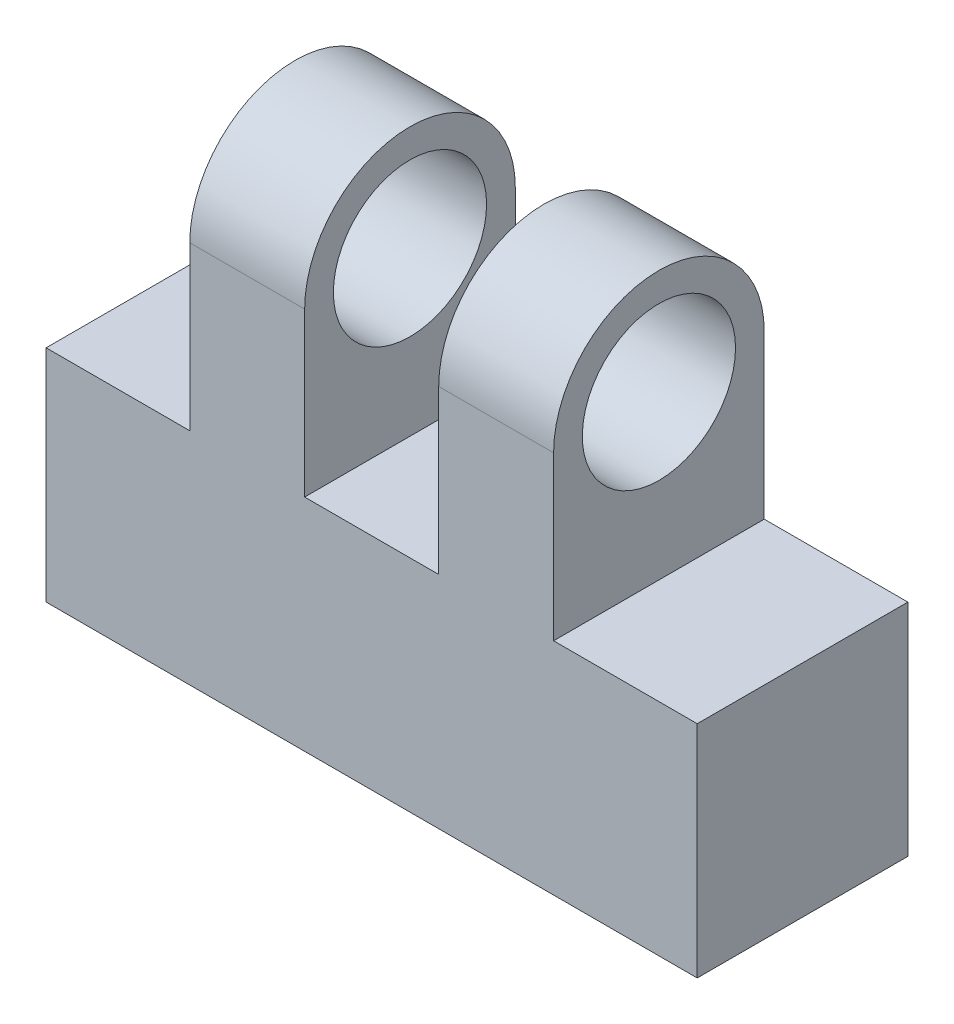
ISO-10303-21;
HEADER;
FILE_DESCRIPTION(('STEP AP214'),'2;1');
FILE_NAME('part.step','',(''),(''),'','','');
FILE_SCHEMA(('AUTOMOTIVE_DESIGN { 1 0 10303 214 1 1 1 1 }'));
ENDSEC;
DATA;
#1=APPLICATION_CONTEXT('core data for automotive mechanical design processes');
#2=APPLICATION_PROTOCOL_DEFINITION('international standard','automotive_design',2000,#1);
#3=PRODUCT_CONTEXT('',#1,'mechanical');
#4=PRODUCT('Part','Part','',(#3));
#5=PRODUCT_RELATED_PRODUCT_CATEGORY('part','',(#4));
#6=PRODUCT_DEFINITION_FORMATION('','',#4);
#7=PRODUCT_DEFINITION_CONTEXT('part definition',#1,'design');
#8=PRODUCT_DEFINITION('design','',#6,#7);
#9=PRODUCT_DEFINITION_SHAPE('','',#8);
#10=(LENGTH_UNIT() NAMED_UNIT(*) SI_UNIT(.MILLI.,.METRE.));
#11=(NAMED_UNIT(*) PLANE_ANGLE_UNIT() SI_UNIT($,.RADIAN.));
#12=(NAMED_UNIT(*) SI_UNIT($,.STERADIAN.) SOLID_ANGLE_UNIT());
#13=UNCERTAINTY_MEASURE_WITH_UNIT(LENGTH_MEASURE(1.E-05),#10,'distance_accuracy_value','');
#14=(GEOMETRIC_REPRESENTATION_CONTEXT(3) GLOBAL_UNCERTAINTY_ASSIGNED_CONTEXT((#13)) GLOBAL_UNIT_ASSIGNED_CONTEXT((#10,
#11,#12)) REPRESENTATION_CONTEXT('',''));
#15=CARTESIAN_POINT('',(0.,0.,0.));
#16=DIRECTION('',(0.,0.,1.));
#17=DIRECTION('',(1.,0.,0.));
#18=AXIS2_PLACEMENT_3D('',#15,#16,#17);
#19=CARTESIAN_POINT('',(34.,0.,0.));
#20=DIRECTION('',(1.,0.,0.));
#21=DIRECTION('',(0.,0.,-1.));
#22=AXIS2_PLACEMENT_3D('',#19,#20,#21);
#23=PLANE('',#22);
#24=DIRECTION('',(0.,1.,0.));
#25=VECTOR('',#24,1.);
#26=CARTESIAN_POINT('',(34.,0.,-5.5));
#27=LINE('',#26,#25);
#28=CARTESIAN_POINT('',(34.,-20.,-5.5));
#29=VERTEX_POINT('',#28);
#30=CARTESIAN_POINT('',(34.,-8.5,-5.5));
#31=VERTEX_POINT('',#30);
#32=EDGE_CURVE('E163',#29,#31,#27,.T.);
#33=ORIENTED_EDGE('',*,*,#32,.T.);
#34=DIRECTION('',(0.,0.,1.));
#35=VECTOR('',#34,1.);
#36=CARTESIAN_POINT('',(34.,-8.5,-5.5));
#37=LINE('',#36,#35);
#38=CARTESIAN_POINT('',(34.,-8.5,5.5));
#39=VERTEX_POINT('',#38);
#40=EDGE_CURVE('E204',#31,#39,#37,.T.);
#41=ORIENTED_EDGE('',*,*,#40,.T.);
#42=DIRECTION('',(0.,-1.,0.));
#43=VECTOR('',#42,1.);
#44=CARTESIAN_POINT('',(34.,0.,5.5));
#45=LINE('',#44,#43);
#46=CARTESIAN_POINT('',(34.,-20.,5.5));
#47=VERTEX_POINT('',#46);
#48=EDGE_CURVE('E151',#39,#47,#45,.T.);
#49=ORIENTED_EDGE('',*,*,#48,.T.);
#50=DIRECTION('',(0.,0.,-1.));
#51=VECTOR('',#50,1.);
#52=CARTESIAN_POINT('',(34.,-20.,5.5));
#53=LINE('',#52,#51);
#54=EDGE_CURVE('E154',#47,#29,#53,.T.);
#55=ORIENTED_EDGE('',*,*,#54,.T.);
#56=EDGE_LOOP('',(#33,#41,#49,#55));
#57=FACE_BOUND('',#56,.T.);
#58=ADVANCED_FACE('F35',(#57),#23,.T.);
#59=CARTESIAN_POINT('',(34.,0.,0.));
#60=DIRECTION('',(-1.,0.,0.));
#61=DIRECTION('',(0.,0.,1.));
#62=AXIS2_PLACEMENT_3D('',#59,#60,#61);
#63=CYLINDRICAL_SURFACE('',#62,5.5);
#64=CARTESIAN_POINT('',(20.5,0.,0.));
#65=DIRECTION('',(-1.,0.,0.));
#66=DIRECTION('',(0.,-1.,0.));
#67=AXIS2_PLACEMENT_3D('',#64,#65,#66);
#68=CIRCLE('',#67,5.5);
#69=CARTESIAN_POINT('',(20.5,0.,5.5));
#70=VERTEX_POINT('',#69);
#71=CARTESIAN_POINT('',(20.5,0.,-5.5));
#72=VERTEX_POINT('',#71);
#73=EDGE_CURVE('E178',#70,#72,#68,.T.);
#74=ORIENTED_EDGE('',*,*,#73,.F.);
#75=DIRECTION('',(-1.,0.,0.));
#76=VECTOR('',#75,1.);
#77=CARTESIAN_POINT('',(34.,0.,5.5));
#78=LINE('',#77,#76);
#79=CARTESIAN_POINT('',(26.5,0.,5.5));
#80=VERTEX_POINT('',#79);
#81=EDGE_CURVE('E11',#80,#70,#78,.T.);
#82=ORIENTED_EDGE('',*,*,#81,.F.);
#83=CARTESIAN_POINT('',(26.5,0.,0.));
#84=DIRECTION('',(1.,0.,0.));
#85=DIRECTION('',(0.,0.,-1.));
#86=AXIS2_PLACEMENT_3D('',#83,#84,#85);
#87=CIRCLE('',#86,5.5);
#88=CARTESIAN_POINT('',(26.5,0.,-5.5));
#89=VERTEX_POINT('',#88);
#90=EDGE_CURVE('E172',#89,#80,#87,.T.);
#91=ORIENTED_EDGE('',*,*,#90,.F.);
#92=DIRECTION('',(-1.,0.,0.));
#93=VECTOR('',#92,1.);
#94=CARTESIAN_POINT('',(34.,0.,-5.5));
#95=LINE('',#94,#93);
#96=EDGE_CURVE('E162',#89,#72,#95,.T.);
#97=ORIENTED_EDGE('',*,*,#96,.T.);
#98=EDGE_LOOP('',(#74,#82,#91,#97));
#99=FACE_BOUND('',#98,.T.);
#100=ADVANCED_FACE('F37',(#99),#63,.T.);
#101=CARTESIAN_POINT('',(7.5,0.,0.));
#102=DIRECTION('',(1.,0.,0.));
#103=DIRECTION('',(0.,1.,0.));
#104=AXIS2_PLACEMENT_3D('',#101,#102,#103);
#105=CIRCLE('',#104,5.5);
#106=CARTESIAN_POINT('',(7.5,0.,-5.5));
#107=VERTEX_POINT('',#106);
#108=CARTESIAN_POINT('',(7.5,0.,5.5));
#109=VERTEX_POINT('',#108);
#110=EDGE_CURVE('E189',#107,#109,#105,.T.);
#111=ORIENTED_EDGE('',*,*,#110,.T.);
#112=CARTESIAN_POINT('',(13.5,0.,5.5));
#113=VERTEX_POINT('',#112);
#114=EDGE_CURVE('E44',#113,#109,#78,.T.);
#115=ORIENTED_EDGE('',*,*,#114,.F.);
#116=CARTESIAN_POINT('',(13.5,0.,0.));
#117=DIRECTION('',(-1.,0.,0.));
#118=DIRECTION('',(0.,-1.,0.));
#119=AXIS2_PLACEMENT_3D('',#116,#117,#118);
#120=CIRCLE('',#119,5.5);
#121=CARTESIAN_POINT('',(13.5,0.,-5.5));
#122=VERTEX_POINT('',#121);
#123=EDGE_CURVE('E175',#113,#122,#120,.T.);
#124=ORIENTED_EDGE('',*,*,#123,.T.);
#125=EDGE_CURVE('E159',#122,#107,#95,.T.);
#126=ORIENTED_EDGE('',*,*,#125,.T.);
#127=EDGE_LOOP('',(#111,#115,#124,#126));
#128=FACE_BOUND('',#127,.T.);
#129=ADVANCED_FACE('F246',(#128),#63,.T.);
#130=CARTESIAN_POINT('',(34.,0.,5.5));
#131=DIRECTION('',(0.,0.,-1.));
#132=DIRECTION('',(0.,1.,0.));
#133=AXIS2_PLACEMENT_3D('',#130,#131,#132);
#134=PLANE('',#133);
#135=ORIENTED_EDGE('',*,*,#114,.T.);
#136=DIRECTION('',(0.,1.,0.));
#137=VECTOR('',#136,1.);
#138=CARTESIAN_POINT('',(7.5,0.,5.5));
#139=LINE('',#138,#137);
#140=CARTESIAN_POINT('',(7.5,-8.5,5.5));
#141=VERTEX_POINT('',#140);
#142=EDGE_CURVE('E136',#141,#109,#139,.T.);
#143=ORIENTED_EDGE('',*,*,#142,.F.);
#144=DIRECTION('',(1.,0.,0.));
#145=VECTOR('',#144,1.);
#146=CARTESIAN_POINT('',(0.,-8.5,5.5));
#147=LINE('',#146,#145);
#148=CARTESIAN_POINT('',(0.,-8.5,5.5));
#149=VERTEX_POINT('',#148);
#150=EDGE_CURVE('E199',#149,#141,#147,.T.);
#151=ORIENTED_EDGE('',*,*,#150,.F.);
#152=DIRECTION('',(0.,-1.,0.));
#153=VECTOR('',#152,1.);
#154=CARTESIAN_POINT('',(0.,0.,5.5));
#155=LINE('',#154,#153);
#156=CARTESIAN_POINT('',(0.,-20.,5.5));
#157=VERTEX_POINT('',#156);
#158=EDGE_CURVE('E144',#149,#157,#155,.T.);
#159=ORIENTED_EDGE('',*,*,#158,.T.);
#160=DIRECTION('',(-1.,0.,0.));
#161=VECTOR('',#160,1.);
#162=CARTESIAN_POINT('',(34.,-20.,5.5));
#163=LINE('',#162,#161);
#164=EDGE_CURVE('E165',#47,#157,#163,.T.);
#165=ORIENTED_EDGE('',*,*,#164,.F.);
#166=ORIENTED_EDGE('',*,*,#48,.F.);
#167=DIRECTION('',(-1.,0.,0.));
#168=VECTOR('',#167,1.);
#169=CARTESIAN_POINT('',(0.,-8.5,5.5));
#170=LINE('',#169,#168);
#171=CARTESIAN_POINT('',(26.5,-8.5,5.5));
#172=VERTEX_POINT('',#171);
#173=EDGE_CURVE('E207',#39,#172,#170,.T.);
#174=ORIENTED_EDGE('',*,*,#173,.T.);
#175=DIRECTION('',(0.,1.,0.));
#176=VECTOR('',#175,1.);
#177=CARTESIAN_POINT('',(26.5,0.,5.5));
#178=LINE('',#177,#176);
#179=EDGE_CURVE('E209',#172,#80,#178,.T.);
#180=ORIENTED_EDGE('',*,*,#179,.T.);
#181=ORIENTED_EDGE('',*,*,#81,.T.);
#182=DIRECTION('',(0.,-1.,0.));
#183=VECTOR('',#182,1.);
#184=CARTESIAN_POINT('',(20.5,0.,5.5));
#185=LINE('',#184,#183);
#186=CARTESIAN_POINT('',(20.5,-8.5,5.5));
#187=VERTEX_POINT('',#186);
#188=EDGE_CURVE('E219',#70,#187,#185,.T.);
#189=ORIENTED_EDGE('',*,*,#188,.T.);
#190=DIRECTION('',(1.,0.,0.));
#191=VECTOR('',#190,1.);
#192=CARTESIAN_POINT('',(0.,-8.5,5.5));
#193=LINE('',#192,#191);
#194=CARTESIAN_POINT('',(13.5,-8.5,5.5));
#195=VERTEX_POINT('',#194);
#196=EDGE_CURVE('E228',#195,#187,#193,.T.);
#197=ORIENTED_EDGE('',*,*,#196,.F.);
#198=DIRECTION('',(0.,-1.,0.));
#199=VECTOR('',#198,1.);
#200=CARTESIAN_POINT('',(13.5,0.,5.5));
#201=LINE('',#200,#199);
#202=EDGE_CURVE('E232',#113,#195,#201,.T.);
#203=ORIENTED_EDGE('',*,*,#202,.F.);
#204=EDGE_LOOP('',(#135,#143,#151,#159,#165,#166,#174,#180,#181,#189,#197,#203));
#205=FACE_BOUND('',#204,.T.);
#206=ADVANCED_FACE('F195',(#205),#134,.F.);
#207=CARTESIAN_POINT('',(34.,0.,-5.5));
#208=DIRECTION('',(0.,0.,1.));
#209=DIRECTION('',(0.,-1.,0.));
#210=AXIS2_PLACEMENT_3D('',#207,#208,#209);
#211=PLANE('',#210);
#212=DIRECTION('',(1.,0.,0.));
#213=VECTOR('',#212,1.);
#214=CARTESIAN_POINT('',(0.,-8.5,-5.5));
#215=LINE('',#214,#213);
#216=CARTESIAN_POINT('',(0.,-8.5,-5.5));
#217=VERTEX_POINT('',#216);
#218=CARTESIAN_POINT('',(7.5,-8.5,-5.5));
#219=VERTEX_POINT('',#218);
#220=EDGE_CURVE('E127',#217,#219,#215,.T.);
#221=ORIENTED_EDGE('',*,*,#220,.T.);
#222=DIRECTION('',(0.,1.,0.));
#223=VECTOR('',#222,1.);
#224=CARTESIAN_POINT('',(7.5,0.,-5.5));
#225=LINE('',#224,#223);
#226=EDGE_CURVE('E52',#219,#107,#225,.T.);
#227=ORIENTED_EDGE('',*,*,#226,.T.);
#228=ORIENTED_EDGE('',*,*,#125,.F.);
#229=DIRECTION('',(0.,-1.,0.));
#230=VECTOR('',#229,1.);
#231=CARTESIAN_POINT('',(13.5,0.,-5.5));
#232=LINE('',#231,#230);
#233=CARTESIAN_POINT('',(13.5,-8.5,-5.5));
#234=VERTEX_POINT('',#233);
#235=EDGE_CURVE('E237',#122,#234,#232,.T.);
#236=ORIENTED_EDGE('',*,*,#235,.T.);
#237=DIRECTION('',(1.,0.,0.));
#238=VECTOR('',#237,1.);
#239=CARTESIAN_POINT('',(0.,-8.5,-5.5));
#240=LINE('',#239,#238);
#241=CARTESIAN_POINT('',(20.5,-8.5,-5.5));
#242=VERTEX_POINT('',#241);
#243=EDGE_CURVE('E60',#234,#242,#240,.T.);
#244=ORIENTED_EDGE('',*,*,#243,.T.);
#245=DIRECTION('',(0.,-1.,0.));
#246=VECTOR('',#245,1.);
#247=CARTESIAN_POINT('',(20.5,0.,-5.5));
#248=LINE('',#247,#246);
#249=EDGE_CURVE('E231',#72,#242,#248,.T.);
#250=ORIENTED_EDGE('',*,*,#249,.F.);
#251=ORIENTED_EDGE('',*,*,#96,.F.);
#252=DIRECTION('',(0.,1.,0.));
#253=VECTOR('',#252,1.);
#254=CARTESIAN_POINT('',(26.5,0.,-5.5));
#255=LINE('',#254,#253);
#256=CARTESIAN_POINT('',(26.5,-8.5,-5.5));
#257=VERTEX_POINT('',#256);
#258=EDGE_CURVE('E212',#257,#89,#255,.T.);
#259=ORIENTED_EDGE('',*,*,#258,.F.);
#260=DIRECTION('',(-1.,0.,0.));
#261=VECTOR('',#260,1.);
#262=CARTESIAN_POINT('',(0.,-8.5,-5.5));
#263=LINE('',#262,#261);
#264=EDGE_CURVE('E214',#31,#257,#263,.T.);
#265=ORIENTED_EDGE('',*,*,#264,.F.);
#266=ORIENTED_EDGE('',*,*,#32,.F.);
#267=DIRECTION('',(-1.,0.,0.));
#268=VECTOR('',#267,1.);
#269=CARTESIAN_POINT('',(34.,-20.,-5.5));
#270=LINE('',#269,#268);
#271=CARTESIAN_POINT('',(0.,-20.,-5.5));
#272=VERTEX_POINT('',#271);
#273=EDGE_CURVE('E150',#29,#272,#270,.T.);
#274=ORIENTED_EDGE('',*,*,#273,.T.);
#275=DIRECTION('',(0.,1.,0.));
#276=VECTOR('',#275,1.);
#277=CARTESIAN_POINT('',(0.,0.,-5.5));
#278=LINE('',#277,#276);
#279=EDGE_CURVE('E143',#272,#217,#278,.T.);
#280=ORIENTED_EDGE('',*,*,#279,.T.);
#281=EDGE_LOOP('',(#221,#227,#228,#236,#244,#250,#251,#259,#265,#266,#274,#280));
#282=FACE_BOUND('',#281,.T.);
#283=ADVANCED_FACE('F147',(#282),#211,.F.);
#284=CARTESIAN_POINT('',(0.,0.,0.));
#285=DIRECTION('',(1.,0.,0.));
#286=DIRECTION('',(0.,0.,-1.));
#287=AXIS2_PLACEMENT_3D('',#284,#285,#286);
#288=PLANE('',#287);
#289=ORIENTED_EDGE('',*,*,#158,.F.);
#290=DIRECTION('',(0.,0.,1.));
#291=VECTOR('',#290,1.);
#292=CARTESIAN_POINT('',(0.,-8.5,-5.5));
#293=LINE('',#292,#291);
#294=EDGE_CURVE('E131',#217,#149,#293,.T.);
#295=ORIENTED_EDGE('',*,*,#294,.F.);
#296=ORIENTED_EDGE('',*,*,#279,.F.);
#297=DIRECTION('',(0.,0.,-1.));
#298=VECTOR('',#297,1.);
#299=CARTESIAN_POINT('',(0.,-20.,5.5));
#300=LINE('',#299,#298);
#301=EDGE_CURVE('E152',#157,#272,#300,.T.);
#302=ORIENTED_EDGE('',*,*,#301,.F.);
#303=EDGE_LOOP('',(#289,#295,#296,#302));
#304=FACE_BOUND('',#303,.T.);
#305=ADVANCED_FACE('F141',(#304),#288,.F.);
#306=CARTESIAN_POINT('',(34.,-20.,5.5));
#307=DIRECTION('',(0.,1.,0.));
#308=DIRECTION('',(0.,0.,1.));
#309=AXIS2_PLACEMENT_3D('',#306,#307,#308);
#310=PLANE('',#309);
#311=ORIENTED_EDGE('',*,*,#301,.T.);
#312=ORIENTED_EDGE('',*,*,#273,.F.);
#313=ORIENTED_EDGE('',*,*,#54,.F.);
#314=ORIENTED_EDGE('',*,*,#164,.T.);
#315=EDGE_LOOP('',(#311,#312,#313,#314));
#316=FACE_BOUND('',#315,.T.);
#317=ADVANCED_FACE('F201',(#316),#310,.F.);
#318=CARTESIAN_POINT('',(26.5,0.,-5.5));
#319=DIRECTION('',(1.,0.,0.));
#320=DIRECTION('',(0.,0.,-1.));
#321=AXIS2_PLACEMENT_3D('',#318,#319,#320);
#322=PLANE('',#321);
#323=CARTESIAN_POINT('',(26.5,0.,0.));
#324=DIRECTION('',(1.,0.,0.));
#325=DIRECTION('',(0.,0.,-1.));
#326=AXIS2_PLACEMENT_3D('',#323,#324,#325);
#327=CIRCLE('',#326,4.);
#328=CARTESIAN_POINT('',(26.5,0.,-4.));
#329=VERTEX_POINT('',#328);
#330=EDGE_CURVE('E169',#329,#329,#327,.T.);
#331=ORIENTED_EDGE('',*,*,#330,.F.);
#332=EDGE_LOOP('',(#331));
#333=FACE_BOUND('',#332,.T.);
#334=ORIENTED_EDGE('',*,*,#90,.T.);
#335=ORIENTED_EDGE('',*,*,#179,.F.);
#336=DIRECTION('',(0.,0.,1.));
#337=VECTOR('',#336,1.);
#338=CARTESIAN_POINT('',(26.5,-8.5,-5.5));
#339=LINE('',#338,#337);
#340=EDGE_CURVE('E220',#257,#172,#339,.T.);
#341=ORIENTED_EDGE('',*,*,#340,.F.);
#342=ORIENTED_EDGE('',*,*,#258,.T.);
#343=EDGE_LOOP('',(#334,#335,#341,#342));
#344=FACE_BOUND('',#343,.T.);
#345=ADVANCED_FACE('F263',(#333,#344),#322,.T.);
#346=CARTESIAN_POINT('',(0.,-8.5,-5.5));
#347=DIRECTION('',(0.,1.,0.));
#348=DIRECTION('',(0.,0.,1.));
#349=AXIS2_PLACEMENT_3D('',#346,#347,#348);
#350=PLANE('',#349);
#351=ORIENTED_EDGE('',*,*,#173,.F.);
#352=ORIENTED_EDGE('',*,*,#40,.F.);
#353=ORIENTED_EDGE('',*,*,#264,.T.);
#354=ORIENTED_EDGE('',*,*,#340,.T.);
#355=EDGE_LOOP('',(#351,#352,#353,#354));
#356=FACE_BOUND('',#355,.T.);
#357=ADVANCED_FACE('F265',(#356),#350,.T.);
#358=CARTESIAN_POINT('',(20.5,0.,-5.5));
#359=DIRECTION('',(-1.,0.,0.));
#360=DIRECTION('',(0.,-1.,0.));
#361=AXIS2_PLACEMENT_3D('',#358,#359,#360);
#362=PLANE('',#361);
#363=CARTESIAN_POINT('',(20.5,0.,0.));
#364=DIRECTION('',(-1.,0.,0.));
#365=DIRECTION('',(0.,-1.,0.));
#366=AXIS2_PLACEMENT_3D('',#363,#364,#365);
#367=CIRCLE('',#366,4.);
#368=CARTESIAN_POINT('',(20.5,-4.,0.));
#369=VERTEX_POINT('',#368);
#370=EDGE_CURVE('E176',#369,#369,#367,.T.);
#371=ORIENTED_EDGE('',*,*,#370,.F.);
#372=EDGE_LOOP('',(#371));
#373=FACE_BOUND('',#372,.T.);
#374=ORIENTED_EDGE('',*,*,#73,.T.);
#375=ORIENTED_EDGE('',*,*,#249,.T.);
#376=DIRECTION('',(0.,0.,1.));
#377=VECTOR('',#376,1.);
#378=CARTESIAN_POINT('',(20.5,-8.5,-5.5));
#379=LINE('',#378,#377);
#380=EDGE_CURVE('E226',#242,#187,#379,.T.);
#381=ORIENTED_EDGE('',*,*,#380,.T.);
#382=ORIENTED_EDGE('',*,*,#188,.F.);
#383=EDGE_LOOP('',(#374,#375,#381,#382));
#384=FACE_BOUND('',#383,.T.);
#385=ADVANCED_FACE('F255',(#373,#384),#362,.T.);
#386=CARTESIAN_POINT('',(13.5,0.,-5.5));
#387=DIRECTION('',(-1.,0.,0.));
#388=DIRECTION('',(0.,-1.,0.));
#389=AXIS2_PLACEMENT_3D('',#386,#387,#388);
#390=PLANE('',#389);
#391=CARTESIAN_POINT('',(13.5,0.,0.));
#392=DIRECTION('',(-1.,0.,0.));
#393=DIRECTION('',(0.,-1.,0.));
#394=AXIS2_PLACEMENT_3D('',#391,#392,#393);
#395=CIRCLE('',#394,4.);
#396=CARTESIAN_POINT('',(13.5,-4.,0.));
#397=VERTEX_POINT('',#396);
#398=EDGE_CURVE('E173',#397,#397,#395,.T.);
#399=ORIENTED_EDGE('',*,*,#398,.T.);
#400=EDGE_LOOP('',(#399));
#401=FACE_BOUND('',#400,.T.);
#402=ORIENTED_EDGE('',*,*,#202,.T.);
#403=DIRECTION('',(0.,0.,1.));
#404=VECTOR('',#403,1.);
#405=CARTESIAN_POINT('',(13.5,-8.5,-5.5));
#406=LINE('',#405,#404);
#407=EDGE_CURVE('E224',#234,#195,#406,.T.);
#408=ORIENTED_EDGE('',*,*,#407,.F.);
#409=ORIENTED_EDGE('',*,*,#235,.F.);
#410=ORIENTED_EDGE('',*,*,#123,.F.);
#411=EDGE_LOOP('',(#402,#408,#409,#410));
#412=FACE_BOUND('',#411,.T.);
#413=ADVANCED_FACE('F251',(#401,#412),#390,.F.);
#414=CARTESIAN_POINT('',(0.,-8.5,-5.5));
#415=DIRECTION('',(0.,-1.,0.));
#416=DIRECTION('',(0.,0.,-1.));
#417=AXIS2_PLACEMENT_3D('',#414,#415,#416);
#418=PLANE('',#417);
#419=ORIENTED_EDGE('',*,*,#196,.T.);
#420=ORIENTED_EDGE('',*,*,#380,.F.);
#421=ORIENTED_EDGE('',*,*,#243,.F.);
#422=ORIENTED_EDGE('',*,*,#407,.T.);
#423=EDGE_LOOP('',(#419,#420,#421,#422));
#424=FACE_BOUND('',#423,.T.);
#425=ADVANCED_FACE('F252',(#424),#418,.F.);
#426=CARTESIAN_POINT('',(7.5,0.,-5.5));
#427=DIRECTION('',(1.,0.,0.));
#428=DIRECTION('',(0.,1.,0.));
#429=AXIS2_PLACEMENT_3D('',#426,#427,#428);
#430=PLANE('',#429);
#431=CARTESIAN_POINT('',(7.5,0.,0.));
#432=DIRECTION('',(1.,0.,0.));
#433=DIRECTION('',(0.,1.,0.));
#434=AXIS2_PLACEMENT_3D('',#431,#432,#433);
#435=CIRCLE('',#434,4.);
#436=CARTESIAN_POINT('',(7.5,4.,0.));
#437=VERTEX_POINT('',#436);
#438=EDGE_CURVE('E39',#437,#437,#435,.T.);
#439=ORIENTED_EDGE('',*,*,#438,.T.);
#440=EDGE_LOOP('',(#439));
#441=FACE_BOUND('',#440,.T.);
#442=ORIENTED_EDGE('',*,*,#110,.F.);
#443=ORIENTED_EDGE('',*,*,#226,.F.);
#444=DIRECTION('',(0.,0.,1.));
#445=VECTOR('',#444,1.);
#446=CARTESIAN_POINT('',(7.5,-8.5,-5.5));
#447=LINE('',#446,#445);
#448=EDGE_CURVE('E133',#219,#141,#447,.T.);
#449=ORIENTED_EDGE('',*,*,#448,.T.);
#450=ORIENTED_EDGE('',*,*,#142,.T.);
#451=EDGE_LOOP('',(#442,#443,#449,#450));
#452=FACE_BOUND('',#451,.T.);
#453=ADVANCED_FACE('F247',(#441,#452),#430,.F.);
#454=CARTESIAN_POINT('',(0.,-8.5,-5.5));
#455=DIRECTION('',(0.,-1.,0.));
#456=DIRECTION('',(0.,0.,-1.));
#457=AXIS2_PLACEMENT_3D('',#454,#455,#456);
#458=PLANE('',#457);
#459=ORIENTED_EDGE('',*,*,#150,.T.);
#460=ORIENTED_EDGE('',*,*,#448,.F.);
#461=ORIENTED_EDGE('',*,*,#220,.F.);
#462=ORIENTED_EDGE('',*,*,#294,.T.);
#463=EDGE_LOOP('',(#459,#460,#461,#462));
#464=FACE_BOUND('',#463,.T.);
#465=ADVANCED_FACE('F130',(#464),#458,.F.);
#466=CARTESIAN_POINT('',(34.,0.,0.));
#467=DIRECTION('',(-1.,0.,0.));
#468=DIRECTION('',(0.,0.,1.));
#469=AXIS2_PLACEMENT_3D('',#466,#467,#468);
#470=CYLINDRICAL_SURFACE('',#469,4.);
#471=ORIENTED_EDGE('',*,*,#330,.T.);
#472=EDGE_LOOP('',(#471));
#473=FACE_BOUND('',#472,.T.);
#474=ORIENTED_EDGE('',*,*,#370,.T.);
#475=EDGE_LOOP('',(#474));
#476=FACE_BOUND('',#475,.T.);
#477=ADVANCED_FACE('F282',(#473,#476),#470,.F.);
#478=ORIENTED_EDGE('',*,*,#438,.F.);
#479=EDGE_LOOP('',(#478));
#480=FACE_BOUND('',#479,.T.);
#481=ORIENTED_EDGE('',*,*,#398,.F.);
#482=EDGE_LOOP('',(#481));
#483=FACE_BOUND('',#482,.T.);
#484=ADVANCED_FACE('F333',(#480,#483),#470,.F.);
#485=CLOSED_SHELL('',(#58,#100,#129,#206,#283,#305,#317,#345,#357,#385,#413,#425,#453,#465,#477,#484));
#486=MANIFOLD_SOLID_BREP('B2',#485);
#487=ADVANCED_BREP_SHAPE_REPRESENTATION('',(#18,#486),#14);
#488=SHAPE_DEFINITION_REPRESENTATION(#9,#487);
ENDSEC;
END-ISO-10303-21;
